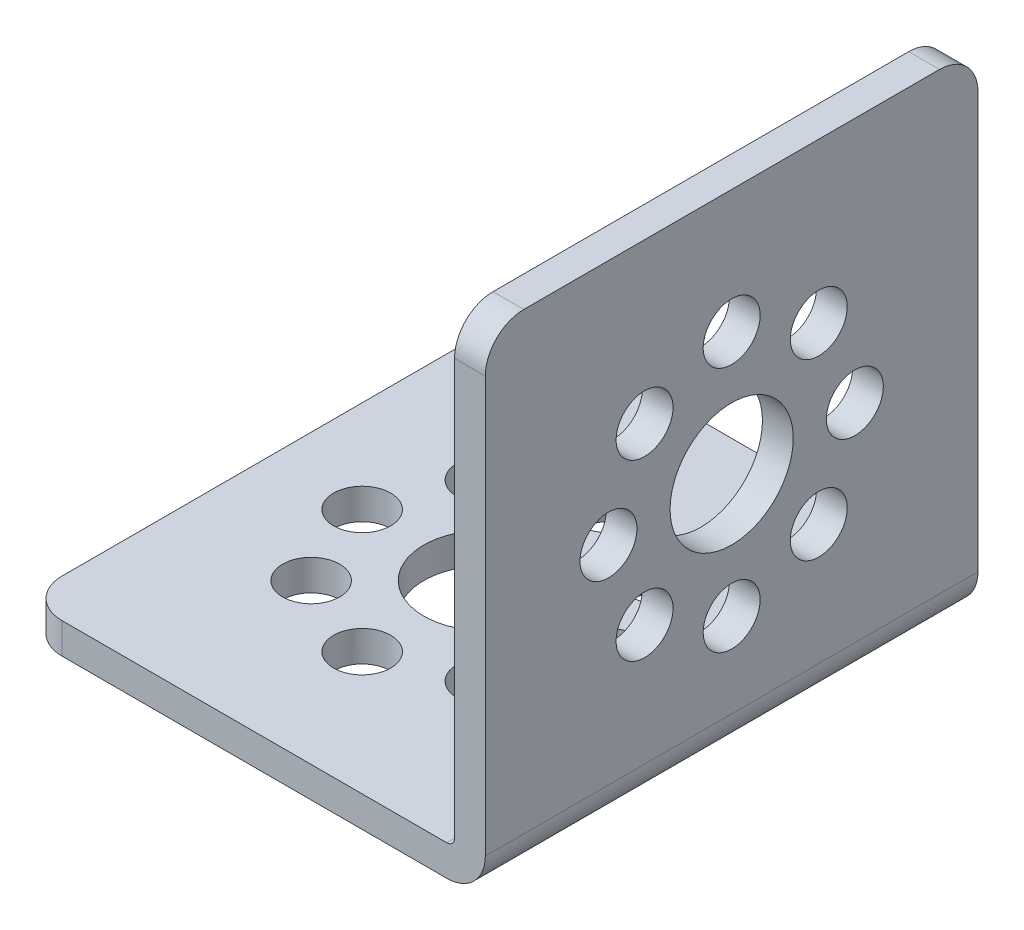
ISO-10303-21;
HEADER;
FILE_DESCRIPTION(('STEP AP214'),'2;1');
FILE_NAME('part.step','',(''),(''),'','','');
FILE_SCHEMA(('AUTOMOTIVE_DESIGN { 1 0 10303 214 1 1 1 1 }'));
ENDSEC;
DATA;
#1=APPLICATION_CONTEXT('core data for automotive mechanical design processes');
#2=APPLICATION_PROTOCOL_DEFINITION('international standard','automotive_design',2000,#1);
#3=PRODUCT_CONTEXT('',#1,'mechanical');
#4=PRODUCT('Part','Part','',(#3));
#5=PRODUCT_RELATED_PRODUCT_CATEGORY('part','',(#4));
#6=PRODUCT_DEFINITION_FORMATION('','',#4);
#7=PRODUCT_DEFINITION_CONTEXT('part definition',#1,'design');
#8=PRODUCT_DEFINITION('design','',#6,#7);
#9=PRODUCT_DEFINITION_SHAPE('','',#8);
#10=(LENGTH_UNIT() NAMED_UNIT(*) SI_UNIT(.MILLI.,.METRE.));
#11=(NAMED_UNIT(*) PLANE_ANGLE_UNIT() SI_UNIT($,.RADIAN.));
#12=(NAMED_UNIT(*) SI_UNIT($,.STERADIAN.) SOLID_ANGLE_UNIT());
#13=UNCERTAINTY_MEASURE_WITH_UNIT(LENGTH_MEASURE(1.E-05),#10,'distance_accuracy_value','');
#14=(GEOMETRIC_REPRESENTATION_CONTEXT(3) GLOBAL_UNCERTAINTY_ASSIGNED_CONTEXT((#13)) GLOBAL_UNIT_ASSIGNED_CONTEXT((#10,
#11,#12)) REPRESENTATION_CONTEXT('',''));
#15=CARTESIAN_POINT('',(0.,0.,0.));
#16=DIRECTION('',(0.,0.,1.));
#17=DIRECTION('',(1.,0.,0.));
#18=AXIS2_PLACEMENT_3D('',#15,#16,#17);
#19=CARTESIAN_POINT('',(-13.5,2.5,16.));
#20=DIRECTION('',(0.,0.,-1.));
#21=DIRECTION('',(-1.,0.,0.));
#22=AXIS2_PLACEMENT_3D('',#19,#20,#21);
#23=CYLINDRICAL_SURFACE('',#22,2.5);
#24=DIRECTION('',(0.,0.,-1.));
#25=VECTOR('',#24,1.);
#26=CARTESIAN_POINT('',(-13.5,0.,16.));
#27=LINE('',#26,#25);
#28=CARTESIAN_POINT('',(-13.5,0.,15.));
#29=VERTEX_POINT('',#28);
#30=CARTESIAN_POINT('',(-13.5,0.,-15.));
#31=VERTEX_POINT('',#30);
#32=EDGE_CURVE('E151',#29,#31,#27,.T.);
#33=ORIENTED_EDGE('',*,*,#32,.F.);
#34=CARTESIAN_POINT('',(-13.5,0.,15.));
#35=CARTESIAN_POINT('',(-13.5425945484461,6.10846210607041E-06,14.9432024778703));
#36=CARTESIAN_POINT('',(-13.5827342058114,0.0010869661887599,14.8846433654454));
#37=CARTESIAN_POINT('',(-13.6578674695257,0.00470530511481721,14.7643748349595));
#38=CARTESIAN_POINT('',(-13.6928625105844,0.007242379238851,14.7026663016879));
#39=CARTESIAN_POINT('',(-13.7880540707013,0.0158417425486205,14.5167561584178));
#40=CARTESIAN_POINT('',(-13.8407876548426,0.0229688547982109,14.3886414120868));
#41=CARTESIAN_POINT('',(-13.9017458329829,0.0324177360250915,14.1968835659889));
#42=CARTESIAN_POINT('',(-13.9186167532368,0.0352534756982862,14.1358516702943));
#43=CARTESIAN_POINT('',(-13.9476911594168,0.0403673146094255,14.012646175024));
#44=CARTESIAN_POINT('',(-13.9598950711363,0.0426454647120707,13.9504726801445));
#45=CARTESIAN_POINT('',(-13.9797896400511,0.046449021440134,13.8238124288917));
#46=CARTESIAN_POINT('',(-13.9873613632842,0.0479544435492506,13.7593064680308));
#47=CARTESIAN_POINT('',(-13.9974698951065,0.0499942113161725,13.6298687229311));
#48=CARTESIAN_POINT('',(-14.0000053292545,0.0505282918841908,13.5649368273009));
#49=CARTESIAN_POINT('',(-14.,0.0505102572168237,13.5));
#50=B_SPLINE_CURVE_WITH_KNOTS('',3,(#34,#35,#36,#37,#38,#39,#40,#41,#42,#43,#44,#45,#46,#47,#48,
#49),.UNSPECIFIED.,.F.,.F.,(4,2,2,2,2,2,2,4),(0.,0.2127955556866,0.425531654776994,
0.839442994762466,1.02946395975276,1.21946758409433,1.41416470985673,1.60891496263684),.UNSPECIFIED.);
#51=CARTESIAN_POINT('',(-14.,0.0505102572168239,13.5));
#52=VERTEX_POINT('',#51);
#53=EDGE_CURVE('E262',#29,#52,#50,.T.);
#54=ORIENTED_EDGE('',*,*,#53,.T.);
#55=DIRECTION('',(0.,0.,-1.));
#56=VECTOR('',#55,1.);
#57=CARTESIAN_POINT('',(-14.,0.0505102572168239,16.));
#58=LINE('',#57,#56);
#59=CARTESIAN_POINT('',(-14.,0.0505102572168239,-13.5));
#60=VERTEX_POINT('',#59);
#61=EDGE_CURVE('E309',#52,#60,#58,.T.);
#62=ORIENTED_EDGE('',*,*,#61,.T.);
#63=CARTESIAN_POINT('',(-14.,0.0505102572168239,-13.5));
#64=CARTESIAN_POINT('',(-14.0000079587461,0.0505361377770259,-13.5710053234085));
#65=CARTESIAN_POINT('',(-13.9969750687538,0.0498934246121133,-13.6420044608555));
#66=CARTESIAN_POINT('',(-13.9848905621802,0.0474603645145872,-13.7834539272455));
#67=CARTESIAN_POINT('',(-13.9758402623456,0.0456702686586032,-13.8539043728434));
#68=CARTESIAN_POINT('',(-13.9520995047711,0.0411913920545866,-13.9919165792114));
#69=CARTESIAN_POINT('',(-13.9375632907298,0.0385274276974296,-14.0595056293752));
#70=CARTESIAN_POINT('',(-13.9029654431423,0.0326277329746468,-14.1932040641045));
#71=CARTESIAN_POINT('',(-13.8829039884763,0.0293920211206174,-14.2593134964978));
#72=CARTESIAN_POINT('',(-13.81842766643,0.0200002303197489,-14.4438417368305));
#73=CARTESIAN_POINT('',(-13.7676226737195,0.0136501147106167,-14.5601161181464));
#74=CARTESIAN_POINT('',(-13.6779679939159,0.00615824080469354,-14.7290953910897));
#75=CARTESIAN_POINT('',(-13.6453560998811,0.00398634082564124,-14.785167832664));
#76=CARTESIAN_POINT('',(-13.5758470053485,0.000909137144144611,-14.8946538667326));
#77=CARTESIAN_POINT('',(-13.5389482383557,4.29803342420007E-06,-14.9480664770301));
#78=CARTESIAN_POINT('',(-13.5,0.,-15.));
#79=B_SPLINE_CURVE_WITH_KNOTS('',3,(#63,#64,#65,#66,#67,#68,#69,#70,#71,#72,#73,#74,#75,#76,#77,
#78),.UNSPECIFIED.,.F.,.F.,(4,2,2,2,2,2,2,4),(0.,0.212937993564529,0.425829406759689,
0.633134045049645,0.840431972620395,1.21985364255403,1.41438925082537,1.60899617057926),.UNSPECIFIED.);
#80=EDGE_CURVE('E256',#60,#31,#79,.T.);
#81=ORIENTED_EDGE('',*,*,#80,.T.);
#82=EDGE_LOOP('',(#33,#54,#62,#81));
#83=FACE_BOUND('',#82,.T.);
#84=ADVANCED_FACE('F35',(#83),#23,.T.);
#85=CARTESIAN_POINT('',(-13.5,0.,16.));
#86=DIRECTION('',(0.,1.,0.));
#87=DIRECTION('',(-1.,0.,0.));
#88=AXIS2_PLACEMENT_3D('',#85,#86,#87);
#89=PLANE('',#88);
#90=CARTESIAN_POINT('',(5.65685424949245,0.,-5.65685424949231));
#91=DIRECTION('',(0.,-1.,0.));
#92=DIRECTION('',(0.707106781186556,0.,-0.707106781186539));
#93=AXIS2_PLACEMENT_3D('',#90,#91,#92);
#94=CIRCLE('',#93,1.84999999999999);
#95=CARTESIAN_POINT('',(6.96500179468757,0.,-6.9650017946874));
#96=VERTEX_POINT('',#95);
#97=EDGE_CURVE('E249',#96,#96,#94,.T.);
#98=ORIENTED_EDGE('',*,*,#97,.F.);
#99=EDGE_LOOP('',(#98));
#100=FACE_BOUND('',#99,.T.);
#101=CARTESIAN_POINT('',(0.,0.,-8.));
#102=DIRECTION('',(0.,-1.,0.));
#103=DIRECTION('',(0.,0.,-1.));
#104=AXIS2_PLACEMENT_3D('',#101,#102,#103);
#105=CIRCLE('',#104,1.84999999999999);
#106=CARTESIAN_POINT('',(1.03173333320782E-13,0.,-9.84999999999999));
#107=VERTEX_POINT('',#106);
#108=EDGE_CURVE('E245',#107,#107,#105,.T.);
#109=ORIENTED_EDGE('',*,*,#108,.F.);
#110=EDGE_LOOP('',(#109));
#111=FACE_BOUND('',#110,.T.);
#112=CARTESIAN_POINT('',(-5.65685424949233,0.,-5.65685424949243));
#113=DIRECTION('',(0.,-1.,0.));
#114=DIRECTION('',(-0.707106781186541,0.,-0.707106781186554));
#115=AXIS2_PLACEMENT_3D('',#112,#113,#114);
#116=CIRCLE('',#115,1.84999999999999);
#117=CARTESIAN_POINT('',(-6.96500179468743,0.,-6.96500179468755));
#118=VERTEX_POINT('',#117);
#119=EDGE_CURVE('E241',#118,#118,#116,.T.);
#120=ORIENTED_EDGE('',*,*,#119,.F.);
#121=EDGE_LOOP('',(#120));
#122=FACE_BOUND('',#121,.T.);
#123=CARTESIAN_POINT('',(-8.,0.,0.));
#124=DIRECTION('',(0.,-1.,0.));
#125=DIRECTION('',(-1.,0.,0.));
#126=AXIS2_PLACEMENT_3D('',#123,#124,#125);
#127=CIRCLE('',#126,1.84999999999999);
#128=CARTESIAN_POINT('',(-9.84999999999999,0.,0.));
#129=VERTEX_POINT('',#128);
#130=EDGE_CURVE('E237',#129,#129,#127,.T.);
#131=ORIENTED_EDGE('',*,*,#130,.F.);
#132=EDGE_LOOP('',(#131));
#133=FACE_BOUND('',#132,.T.);
#134=CARTESIAN_POINT('',(-5.65685424949241,0.,5.65685424949235));
#135=DIRECTION('',(0.,-1.,0.));
#136=DIRECTION('',(-0.707106781186551,0.,0.707106781186544));
#137=AXIS2_PLACEMENT_3D('',#134,#135,#136);
#138=CIRCLE('',#137,1.84999999999999);
#139=CARTESIAN_POINT('',(-6.96500179468752,0.,6.96500179468745));
#140=VERTEX_POINT('',#139);
#141=EDGE_CURVE('E233',#140,#140,#138,.T.);
#142=ORIENTED_EDGE('',*,*,#141,.F.);
#143=EDGE_LOOP('',(#142));
#144=FACE_BOUND('',#143,.T.);
#145=CARTESIAN_POINT('',(0.,0.,8.));
#146=DIRECTION('',(0.,-1.,0.));
#147=DIRECTION('',(0.,0.,1.));
#148=AXIS2_PLACEMENT_3D('',#145,#146,#147);
#149=CIRCLE('',#148,1.84999999999999);
#150=CARTESIAN_POINT('',(0.,0.,9.84999999999999));
#151=VERTEX_POINT('',#150);
#152=EDGE_CURVE('E229',#151,#151,#149,.T.);
#153=ORIENTED_EDGE('',*,*,#152,.F.);
#154=EDGE_LOOP('',(#153));
#155=FACE_BOUND('',#154,.T.);
#156=CARTESIAN_POINT('',(5.65685424949237,0.,5.65685424949239));
#157=DIRECTION('',(0.,-1.,0.));
#158=DIRECTION('',(0.707106781186546,0.,0.707106781186549));
#159=AXIS2_PLACEMENT_3D('',#156,#157,#158);
#160=CIRCLE('',#159,1.84999999999999);
#161=CARTESIAN_POINT('',(6.96500179468748,0.,6.9650017946875));
#162=VERTEX_POINT('',#161);
#163=EDGE_CURVE('E225',#162,#162,#160,.T.);
#164=ORIENTED_EDGE('',*,*,#163,.F.);
#165=EDGE_LOOP('',(#164));
#166=FACE_BOUND('',#165,.T.);
#167=CARTESIAN_POINT('',(8.,0.,0.));
#168=DIRECTION('',(0.,-1.,0.));
#169=DIRECTION('',(1.,0.,0.));
#170=AXIS2_PLACEMENT_3D('',#167,#168,#169);
#171=CIRCLE('',#170,1.84999999999999);
#172=CARTESIAN_POINT('',(9.84999999999999,0.,0.));
#173=VERTEX_POINT('',#172);
#174=EDGE_CURVE('E221',#173,#173,#171,.T.);
#175=ORIENTED_EDGE('',*,*,#174,.F.);
#176=EDGE_LOOP('',(#175));
#177=FACE_BOUND('',#176,.T.);
#178=CARTESIAN_POINT('',(0.,0.,0.));
#179=DIRECTION('',(0.,-1.,0.));
#180=DIRECTION('',(1.,0.,0.));
#181=AXIS2_PLACEMENT_3D('',#178,#179,#180);
#182=CIRCLE('',#181,4.00000000000001);
#183=CARTESIAN_POINT('',(4.00000000000001,0.,0.));
#184=VERTEX_POINT('',#183);
#185=EDGE_CURVE('E216',#184,#184,#182,.T.);
#186=ORIENTED_EDGE('',*,*,#185,.F.);
#187=EDGE_LOOP('',(#186));
#188=FACE_BOUND('',#187,.T.);
#189=DIRECTION('',(1.,0.,0.));
#190=VECTOR('',#189,1.);
#191=CARTESIAN_POINT('',(-13.5,0.,16.));
#192=LINE('',#191,#190);
#193=CARTESIAN_POINT('',(-11.5,0.,16.));
#194=VERTEX_POINT('',#193);
#195=CARTESIAN_POINT('',(13.5,0.,16.));
#196=VERTEX_POINT('',#195);
#197=EDGE_CURVE('E132',#194,#196,#192,.T.);
#198=ORIENTED_EDGE('',*,*,#197,.F.);
#199=CARTESIAN_POINT('',(-11.5,0.,13.5));
#200=DIRECTION('',(0.,1.,0.));
#201=DIRECTION('',(-1.,0.,0.));
#202=AXIS2_PLACEMENT_3D('',#199,#200,#201);
#203=CIRCLE('',#202,2.5);
#204=EDGE_CURVE('E254',#194,#29,#203,.F.);
#205=ORIENTED_EDGE('',*,*,#204,.T.);
#206=ORIENTED_EDGE('',*,*,#32,.T.);
#207=CARTESIAN_POINT('',(-11.5,0.,-13.5));
#208=DIRECTION('',(0.,1.,0.));
#209=DIRECTION('',(-1.,0.,0.));
#210=AXIS2_PLACEMENT_3D('',#207,#208,#209);
#211=CIRCLE('',#210,2.5);
#212=CARTESIAN_POINT('',(-11.5,0.,-16.));
#213=VERTEX_POINT('',#212);
#214=EDGE_CURVE('E252',#31,#213,#211,.F.);
#215=ORIENTED_EDGE('',*,*,#214,.T.);
#216=DIRECTION('',(1.,0.,0.));
#217=VECTOR('',#216,1.);
#218=CARTESIAN_POINT('',(-13.5,0.,-16.));
#219=LINE('',#218,#217);
#220=CARTESIAN_POINT('',(13.5,0.,-16.));
#221=VERTEX_POINT('',#220);
#222=EDGE_CURVE('E148',#213,#221,#219,.T.);
#223=ORIENTED_EDGE('',*,*,#222,.T.);
#224=DIRECTION('',(0.,0.,-1.));
#225=VECTOR('',#224,1.);
#226=CARTESIAN_POINT('',(13.5,0.,16.));
#227=LINE('',#226,#225);
#228=EDGE_CURVE('E146',#196,#221,#227,.T.);
#229=ORIENTED_EDGE('',*,*,#228,.F.);
#230=EDGE_LOOP('',(#198,#205,#206,#215,#223,#229));
#231=FACE_BOUND('',#230,.T.);
#232=ADVANCED_FACE('F147',(#100,#111,#122,#133,#144,#155,#166,#177,#188,#231),#89,.F.);
#233=CARTESIAN_POINT('',(13.5,2.50000000000001,16.));
#234=DIRECTION('',(0.,0.,-1.));
#235=DIRECTION('',(-1.,0.,0.));
#236=AXIS2_PLACEMENT_3D('',#233,#234,#235);
#237=CYLINDRICAL_SURFACE('',#236,2.5);
#238=CARTESIAN_POINT('',(13.5,2.50000000000001,-16.));
#239=DIRECTION('',(0.,0.,1.));
#240=DIRECTION('',(-1.,0.,0.));
#241=AXIS2_PLACEMENT_3D('',#238,#239,#240);
#242=CIRCLE('',#241,2.5);
#243=CARTESIAN_POINT('',(16.,2.50000000000001,-16.));
#244=VERTEX_POINT('',#243);
#245=EDGE_CURVE('E170',#221,#244,#242,.T.);
#246=ORIENTED_EDGE('',*,*,#245,.T.);
#247=DIRECTION('',(0.,0.,-1.));
#248=VECTOR('',#247,1.);
#249=CARTESIAN_POINT('',(16.,2.50000000000001,16.));
#250=LINE('',#249,#248);
#251=CARTESIAN_POINT('',(16.,2.50000000000001,16.));
#252=VERTEX_POINT('',#251);
#253=EDGE_CURVE('E152',#252,#244,#250,.T.);
#254=ORIENTED_EDGE('',*,*,#253,.F.);
#255=CARTESIAN_POINT('',(13.5,2.50000000000001,16.));
#256=DIRECTION('',(0.,0.,1.));
#257=DIRECTION('',(-1.,0.,0.));
#258=AXIS2_PLACEMENT_3D('',#255,#256,#257);
#259=CIRCLE('',#258,2.5);
#260=EDGE_CURVE('E138',#196,#252,#259,.T.);
#261=ORIENTED_EDGE('',*,*,#260,.F.);
#262=ORIENTED_EDGE('',*,*,#228,.T.);
#263=EDGE_LOOP('',(#246,#254,#261,#262));
#264=FACE_BOUND('',#263,.T.);
#265=ADVANCED_FACE('F154',(#264),#237,.T.);
#266=CARTESIAN_POINT('',(16.,2.50000000000001,16.));
#267=DIRECTION('',(-1.,0.,0.));
#268=DIRECTION('',(0.,-1.,0.));
#269=AXIS2_PLACEMENT_3D('',#266,#267,#268);
#270=PLANE('',#269);
#271=CARTESIAN_POINT('',(16.,10.3431457505076,-5.65685424949231));
#272=DIRECTION('',(-1.,0.,0.));
#273=DIRECTION('',(0.,-0.707106781186556,-0.707106781186539));
#274=AXIS2_PLACEMENT_3D('',#271,#272,#273);
#275=CIRCLE('',#274,1.84999999999999);
#276=CARTESIAN_POINT('',(16.,9.03499820531244,-6.9650017946874));
#277=VERTEX_POINT('',#276);
#278=EDGE_CURVE('E310',#277,#277,#275,.T.);
#279=ORIENTED_EDGE('',*,*,#278,.T.);
#280=EDGE_LOOP('',(#279));
#281=FACE_BOUND('',#280,.T.);
#282=CARTESIAN_POINT('',(16.,15.9999999999999,-7.99999999999999));
#283=DIRECTION('',(-1.,0.,0.));
#284=DIRECTION('',(0.,0.,-1.));
#285=AXIS2_PLACEMENT_3D('',#282,#283,#284);
#286=CIRCLE('',#285,1.84999999999999);
#287=CARTESIAN_POINT('',(16.,15.9999999999999,-9.84999999999998));
#288=VERTEX_POINT('',#287);
#289=EDGE_CURVE('E318',#288,#288,#286,.T.);
#290=ORIENTED_EDGE('',*,*,#289,.T.);
#291=EDGE_LOOP('',(#290));
#292=FACE_BOUND('',#291,.T.);
#293=CARTESIAN_POINT('',(16.,21.6568542494923,-5.65685424949243));
#294=DIRECTION('',(-1.,0.,0.));
#295=DIRECTION('',(0.,0.707106781186541,-0.707106781186554));
#296=AXIS2_PLACEMENT_3D('',#293,#294,#295);
#297=CIRCLE('',#296,1.84999999999999);
#298=CARTESIAN_POINT('',(16.,22.9650017946874,-6.96500179468754));
#299=VERTEX_POINT('',#298);
#300=EDGE_CURVE('E324',#299,#299,#297,.T.);
#301=ORIENTED_EDGE('',*,*,#300,.T.);
#302=EDGE_LOOP('',(#301));
#303=FACE_BOUND('',#302,.T.);
#304=CARTESIAN_POINT('',(16.,24.,0.));
#305=DIRECTION('',(-1.,0.,0.));
#306=DIRECTION('',(0.,1.,0.));
#307=AXIS2_PLACEMENT_3D('',#304,#305,#306);
#308=CIRCLE('',#307,1.84999999999999);
#309=CARTESIAN_POINT('',(16.,25.85,0.));
#310=VERTEX_POINT('',#309);
#311=EDGE_CURVE('E330',#310,#310,#308,.T.);
#312=ORIENTED_EDGE('',*,*,#311,.T.);
#313=EDGE_LOOP('',(#312));
#314=FACE_BOUND('',#313,.T.);
#315=CARTESIAN_POINT('',(16.,21.6568542494924,5.65685424949233));
#316=DIRECTION('',(-1.,0.,0.));
#317=DIRECTION('',(0.,0.707106781186551,0.707106781186544));
#318=AXIS2_PLACEMENT_3D('',#315,#316,#317);
#319=CIRCLE('',#318,1.84999999999999);
#320=CARTESIAN_POINT('',(16.,22.9650017946875,6.96500179468743));
#321=VERTEX_POINT('',#320);
#322=EDGE_CURVE('E336',#321,#321,#319,.T.);
#323=ORIENTED_EDGE('',*,*,#322,.T.);
#324=EDGE_LOOP('',(#323));
#325=FACE_BOUND('',#324,.T.);
#326=CARTESIAN_POINT('',(16.,16.,7.99999999999998));
#327=DIRECTION('',(-1.,0.,0.));
#328=DIRECTION('',(0.,0.,1.));
#329=AXIS2_PLACEMENT_3D('',#326,#327,#328);
#330=CIRCLE('',#329,1.84999999999999);
#331=CARTESIAN_POINT('',(16.,16.,9.84999999999997));
#332=VERTEX_POINT('',#331);
#333=EDGE_CURVE('E342',#332,#332,#330,.T.);
#334=ORIENTED_EDGE('',*,*,#333,.T.);
#335=EDGE_LOOP('',(#334));
#336=FACE_BOUND('',#335,.T.);
#337=CARTESIAN_POINT('',(16.,10.3431457505076,5.65685424949237));
#338=DIRECTION('',(-1.,0.,0.));
#339=DIRECTION('',(0.,-0.707106781186546,0.707106781186549));
#340=AXIS2_PLACEMENT_3D('',#337,#338,#339);
#341=CIRCLE('',#340,1.84999999999999);
#342=CARTESIAN_POINT('',(16.,9.03499820531254,6.96500179468748));
#343=VERTEX_POINT('',#342);
#344=EDGE_CURVE('E348',#343,#343,#341,.T.);
#345=ORIENTED_EDGE('',*,*,#344,.T.);
#346=EDGE_LOOP('',(#345));
#347=FACE_BOUND('',#346,.T.);
#348=CARTESIAN_POINT('',(16.,8.00000000000002,0.));
#349=DIRECTION('',(-1.,0.,0.));
#350=DIRECTION('',(0.,-1.,0.));
#351=AXIS2_PLACEMENT_3D('',#348,#349,#350);
#352=CIRCLE('',#351,1.84999999999999);
#353=CARTESIAN_POINT('',(16.,6.15000000000003,0.));
#354=VERTEX_POINT('',#353);
#355=EDGE_CURVE('E220',#354,#354,#352,.T.);
#356=ORIENTED_EDGE('',*,*,#355,.T.);
#357=EDGE_LOOP('',(#356));
#358=FACE_BOUND('',#357,.T.);
#359=CARTESIAN_POINT('',(16.,16.,0.));
#360=DIRECTION('',(-1.,0.,0.));
#361=DIRECTION('',(0.,-1.,0.));
#362=AXIS2_PLACEMENT_3D('',#359,#360,#361);
#363=CIRCLE('',#362,4.00000000000001);
#364=CARTESIAN_POINT('',(16.,12.,0.));
#365=VERTEX_POINT('',#364);
#366=EDGE_CURVE('E375',#365,#365,#363,.T.);
#367=ORIENTED_EDGE('',*,*,#366,.T.);
#368=EDGE_LOOP('',(#367));
#369=FACE_BOUND('',#368,.T.);
#370=DIRECTION('',(0.,1.,0.));
#371=VECTOR('',#370,1.);
#372=CARTESIAN_POINT('',(16.,2.50000000000001,-16.));
#373=LINE('',#372,#371);
#374=CARTESIAN_POINT('',(16.,29.5,-16.));
#375=VERTEX_POINT('',#374);
#376=EDGE_CURVE('E173',#244,#375,#373,.T.);
#377=ORIENTED_EDGE('',*,*,#376,.T.);
#378=CARTESIAN_POINT('',(16.,29.5,-13.5));
#379=DIRECTION('',(-1.,0.,0.));
#380=DIRECTION('',(0.,-1.,0.));
#381=AXIS2_PLACEMENT_3D('',#378,#379,#380);
#382=CIRCLE('',#381,2.5);
#383=CARTESIAN_POINT('',(16.,32.,-13.5));
#384=VERTEX_POINT('',#383);
#385=EDGE_CURVE('E208',#375,#384,#382,.F.);
#386=ORIENTED_EDGE('',*,*,#385,.T.);
#387=DIRECTION('',(0.,0.,-1.));
#388=VECTOR('',#387,1.);
#389=CARTESIAN_POINT('',(16.,32.,16.));
#390=LINE('',#389,#388);
#391=CARTESIAN_POINT('',(16.,32.,13.5));
#392=VERTEX_POINT('',#391);
#393=EDGE_CURVE('E189',#392,#384,#390,.T.);
#394=ORIENTED_EDGE('',*,*,#393,.F.);
#395=CARTESIAN_POINT('',(16.,29.5,13.5));
#396=DIRECTION('',(-1.,0.,0.));
#397=DIRECTION('',(0.,-1.,0.));
#398=AXIS2_PLACEMENT_3D('',#395,#396,#397);
#399=CIRCLE('',#398,2.5);
#400=CARTESIAN_POINT('',(16.,29.5,16.));
#401=VERTEX_POINT('',#400);
#402=EDGE_CURVE('E206',#392,#401,#399,.F.);
#403=ORIENTED_EDGE('',*,*,#402,.T.);
#404=DIRECTION('',(0.,1.,0.));
#405=VECTOR('',#404,1.);
#406=CARTESIAN_POINT('',(16.,2.50000000000001,16.));
#407=LINE('',#406,#405);
#408=EDGE_CURVE('E157',#252,#401,#407,.T.);
#409=ORIENTED_EDGE('',*,*,#408,.F.);
#410=ORIENTED_EDGE('',*,*,#253,.T.);
#411=EDGE_LOOP('',(#377,#386,#394,#403,#409,#410));
#412=FACE_BOUND('',#411,.T.);
#413=ADVANCED_FACE('F390',(#281,#292,#303,#314,#325,#336,#347,#358,#369,#412),#270,.F.);
#414=CARTESIAN_POINT('',(16.,32.,16.));
#415=DIRECTION('',(0.,-1.,0.));
#416=DIRECTION('',(0.,0.,-1.));
#417=AXIS2_PLACEMENT_3D('',#414,#415,#416);
#418=PLANE('',#417);
#419=ORIENTED_EDGE('',*,*,#393,.T.);
#420=DIRECTION('',(-1.,0.,0.));
#421=VECTOR('',#420,1.);
#422=CARTESIAN_POINT('',(16.,32.,-13.5));
#423=LINE('',#422,#421);
#424=CARTESIAN_POINT('',(14.,32.,-13.5));
#425=VERTEX_POINT('',#424);
#426=EDGE_CURVE('E197',#384,#425,#423,.T.);
#427=ORIENTED_EDGE('',*,*,#426,.T.);
#428=DIRECTION('',(0.,0.,-1.));
#429=VECTOR('',#428,1.);
#430=CARTESIAN_POINT('',(14.,32.,16.));
#431=LINE('',#430,#429);
#432=CARTESIAN_POINT('',(14.,32.,13.5));
#433=VERTEX_POINT('',#432);
#434=EDGE_CURVE('E186',#433,#425,#431,.T.);
#435=ORIENTED_EDGE('',*,*,#434,.F.);
#436=DIRECTION('',(-1.,0.,0.));
#437=VECTOR('',#436,1.);
#438=CARTESIAN_POINT('',(16.,32.,13.5));
#439=LINE('',#438,#437);
#440=EDGE_CURVE('E195',#433,#392,#439,.F.);
#441=ORIENTED_EDGE('',*,*,#440,.T.);
#442=EDGE_LOOP('',(#419,#427,#435,#441));
#443=FACE_BOUND('',#442,.T.);
#444=ADVANCED_FACE('F436',(#443),#418,.F.);
#445=CARTESIAN_POINT('',(14.,32.,16.));
#446=DIRECTION('',(1.,0.,0.));
#447=DIRECTION('',(0.,1.,0.));
#448=AXIS2_PLACEMENT_3D('',#445,#446,#447);
#449=PLANE('',#448);
#450=CARTESIAN_POINT('',(14.,10.3431457505076,-5.65685424949231));
#451=DIRECTION('',(1.,0.,0.));
#452=DIRECTION('',(0.,1.,0.));
#453=AXIS2_PLACEMENT_3D('',#450,#451,#452);
#454=CIRCLE('',#453,1.84999999999999);
#455=CARTESIAN_POINT('',(14.,12.1931457505076,-5.65685424949231));
#456=VERTEX_POINT('',#455);
#457=EDGE_CURVE('E313',#456,#456,#454,.T.);
#458=ORIENTED_EDGE('',*,*,#457,.T.);
#459=EDGE_LOOP('',(#458));
#460=FACE_BOUND('',#459,.T.);
#461=CARTESIAN_POINT('',(14.,15.9999999999999,-7.99999999999999));
#462=DIRECTION('',(1.,0.,0.));
#463=DIRECTION('',(0.,1.,0.));
#464=AXIS2_PLACEMENT_3D('',#461,#462,#463);
#465=CIRCLE('',#464,1.84999999999999);
#466=CARTESIAN_POINT('',(14.,17.8499999999999,-7.99999999999999));
#467=VERTEX_POINT('',#466);
#468=EDGE_CURVE('E321',#467,#467,#465,.T.);
#469=ORIENTED_EDGE('',*,*,#468,.T.);
#470=EDGE_LOOP('',(#469));
#471=FACE_BOUND('',#470,.T.);
#472=CARTESIAN_POINT('',(14.,21.6568542494923,-5.65685424949243));
#473=DIRECTION('',(1.,0.,0.));
#474=DIRECTION('',(0.,1.,0.));
#475=AXIS2_PLACEMENT_3D('',#472,#473,#474);
#476=CIRCLE('',#475,1.84999999999999);
#477=CARTESIAN_POINT('',(14.,23.5068542494923,-5.65685424949243));
#478=VERTEX_POINT('',#477);
#479=EDGE_CURVE('E327',#478,#478,#476,.T.);
#480=ORIENTED_EDGE('',*,*,#479,.T.);
#481=EDGE_LOOP('',(#480));
#482=FACE_BOUND('',#481,.T.);
#483=CARTESIAN_POINT('',(14.,24.,0.));
#484=DIRECTION('',(1.,0.,0.));
#485=DIRECTION('',(0.,1.,0.));
#486=AXIS2_PLACEMENT_3D('',#483,#484,#485);
#487=CIRCLE('',#486,1.84999999999999);
#488=CARTESIAN_POINT('',(14.,25.85,0.));
#489=VERTEX_POINT('',#488);
#490=EDGE_CURVE('E333',#489,#489,#487,.T.);
#491=ORIENTED_EDGE('',*,*,#490,.T.);
#492=EDGE_LOOP('',(#491));
#493=FACE_BOUND('',#492,.T.);
#494=CARTESIAN_POINT('',(14.,21.6568542494924,5.65685424949233));
#495=DIRECTION('',(1.,0.,0.));
#496=DIRECTION('',(0.,1.,0.));
#497=AXIS2_PLACEMENT_3D('',#494,#495,#496);
#498=CIRCLE('',#497,1.84999999999999);
#499=CARTESIAN_POINT('',(14.,23.5068542494924,5.65685424949233));
#500=VERTEX_POINT('',#499);
#501=EDGE_CURVE('E339',#500,#500,#498,.T.);
#502=ORIENTED_EDGE('',*,*,#501,.T.);
#503=EDGE_LOOP('',(#502));
#504=FACE_BOUND('',#503,.T.);
#505=CARTESIAN_POINT('',(14.,16.,7.99999999999998));
#506=DIRECTION('',(1.,0.,0.));
#507=DIRECTION('',(0.,1.,0.));
#508=AXIS2_PLACEMENT_3D('',#505,#506,#507);
#509=CIRCLE('',#508,1.84999999999999);
#510=CARTESIAN_POINT('',(14.,17.85,7.99999999999998));
#511=VERTEX_POINT('',#510);
#512=EDGE_CURVE('E345',#511,#511,#509,.T.);
#513=ORIENTED_EDGE('',*,*,#512,.T.);
#514=EDGE_LOOP('',(#513));
#515=FACE_BOUND('',#514,.T.);
#516=CARTESIAN_POINT('',(14.,10.3431457505076,5.65685424949237));
#517=DIRECTION('',(1.,0.,0.));
#518=DIRECTION('',(0.,1.,0.));
#519=AXIS2_PLACEMENT_3D('',#516,#517,#518);
#520=CIRCLE('',#519,1.84999999999999);
#521=CARTESIAN_POINT('',(14.,12.1931457505076,5.65685424949237));
#522=VERTEX_POINT('',#521);
#523=EDGE_CURVE('E351',#522,#522,#520,.T.);
#524=ORIENTED_EDGE('',*,*,#523,.T.);
#525=EDGE_LOOP('',(#524));
#526=FACE_BOUND('',#525,.T.);
#527=CARTESIAN_POINT('',(14.,8.00000000000002,0.));
#528=DIRECTION('',(1.,0.,0.));
#529=DIRECTION('',(0.,1.,0.));
#530=AXIS2_PLACEMENT_3D('',#527,#528,#529);
#531=CIRCLE('',#530,1.84999999999999);
#532=CARTESIAN_POINT('',(14.,9.85000000000001,0.));
#533=VERTEX_POINT('',#532);
#534=EDGE_CURVE('E372',#533,#533,#531,.T.);
#535=ORIENTED_EDGE('',*,*,#534,.T.);
#536=EDGE_LOOP('',(#535));
#537=FACE_BOUND('',#536,.T.);
#538=CARTESIAN_POINT('',(14.,16.,0.));
#539=DIRECTION('',(1.,0.,0.));
#540=DIRECTION('',(0.,1.,0.));
#541=AXIS2_PLACEMENT_3D('',#538,#539,#540);
#542=CIRCLE('',#541,4.00000000000001);
#543=CARTESIAN_POINT('',(14.,20.,0.));
#544=VERTEX_POINT('',#543);
#545=EDGE_CURVE('E378',#544,#544,#542,.T.);
#546=ORIENTED_EDGE('',*,*,#545,.T.);
#547=EDGE_LOOP('',(#546));
#548=FACE_BOUND('',#547,.T.);
#549=ORIENTED_EDGE('',*,*,#434,.T.);
#550=CARTESIAN_POINT('',(14.,29.5,-13.5));
#551=DIRECTION('',(1.,0.,0.));
#552=DIRECTION('',(0.,1.,0.));
#553=AXIS2_PLACEMENT_3D('',#550,#551,#552);
#554=CIRCLE('',#553,2.5);
#555=CARTESIAN_POINT('',(14.,29.5,-16.));
#556=VERTEX_POINT('',#555);
#557=EDGE_CURVE('E202',#425,#556,#554,.F.);
#558=ORIENTED_EDGE('',*,*,#557,.T.);
#559=DIRECTION('',(0.,-1.,0.));
#560=VECTOR('',#559,1.);
#561=CARTESIAN_POINT('',(14.,32.,-16.));
#562=LINE('',#561,#560);
#563=CARTESIAN_POINT('',(14.,2.5,-16.));
#564=VERTEX_POINT('',#563);
#565=EDGE_CURVE('E176',#556,#564,#562,.T.);
#566=ORIENTED_EDGE('',*,*,#565,.T.);
#567=DIRECTION('',(0.,0.,-1.));
#568=VECTOR('',#567,1.);
#569=CARTESIAN_POINT('',(14.,2.5,16.));
#570=LINE('',#569,#568);
#571=CARTESIAN_POINT('',(14.,2.5,16.));
#572=VERTEX_POINT('',#571);
#573=EDGE_CURVE('E183',#572,#564,#570,.T.);
#574=ORIENTED_EDGE('',*,*,#573,.F.);
#575=DIRECTION('',(0.,-1.,0.));
#576=VECTOR('',#575,1.);
#577=CARTESIAN_POINT('',(14.,32.,16.));
#578=LINE('',#577,#576);
#579=CARTESIAN_POINT('',(14.,29.5,16.));
#580=VERTEX_POINT('',#579);
#581=EDGE_CURVE('E159',#580,#572,#578,.T.);
#582=ORIENTED_EDGE('',*,*,#581,.F.);
#583=CARTESIAN_POINT('',(14.,29.5,13.5));
#584=DIRECTION('',(1.,0.,0.));
#585=DIRECTION('',(0.,1.,0.));
#586=AXIS2_PLACEMENT_3D('',#583,#584,#585);
#587=CIRCLE('',#586,2.5);
#588=EDGE_CURVE('E200',#580,#433,#587,.F.);
#589=ORIENTED_EDGE('',*,*,#588,.T.);
#590=EDGE_LOOP('',(#549,#558,#566,#574,#582,#589));
#591=FACE_BOUND('',#590,.T.);
#592=ADVANCED_FACE('F433',(#460,#471,#482,#493,#504,#515,#526,#537,#548,#591),#449,.F.);
#593=CARTESIAN_POINT('',(13.5,2.5,16.));
#594=DIRECTION('',(0.,0.,-1.));
#595=DIRECTION('',(-1.,0.,0.));
#596=AXIS2_PLACEMENT_3D('',#593,#594,#595);
#597=CYLINDRICAL_SURFACE('',#596,0.5);
#598=CARTESIAN_POINT('',(13.5,2.5,-16.));
#599=DIRECTION('',(0.,0.,-1.));
#600=DIRECTION('',(-1.,0.,0.));
#601=AXIS2_PLACEMENT_3D('',#598,#599,#600);
#602=CIRCLE('',#601,0.5);
#603=CARTESIAN_POINT('',(13.5,2.,-16.));
#604=VERTEX_POINT('',#603);
#605=EDGE_CURVE('E178',#564,#604,#602,.T.);
#606=ORIENTED_EDGE('',*,*,#605,.T.);
#607=DIRECTION('',(0.,0.,-1.));
#608=VECTOR('',#607,1.);
#609=CARTESIAN_POINT('',(13.5,2.,16.));
#610=LINE('',#609,#608);
#611=CARTESIAN_POINT('',(13.5,2.,16.));
#612=VERTEX_POINT('',#611);
#613=EDGE_CURVE('E168',#612,#604,#610,.T.);
#614=ORIENTED_EDGE('',*,*,#613,.F.);
#615=CARTESIAN_POINT('',(13.5,2.5,16.));
#616=DIRECTION('',(0.,0.,-1.));
#617=DIRECTION('',(-1.,0.,0.));
#618=AXIS2_PLACEMENT_3D('',#615,#616,#617);
#619=CIRCLE('',#618,0.5);
#620=EDGE_CURVE('E164',#572,#612,#619,.T.);
#621=ORIENTED_EDGE('',*,*,#620,.F.);
#622=ORIENTED_EDGE('',*,*,#573,.T.);
#623=EDGE_LOOP('',(#606,#614,#621,#622));
#624=FACE_BOUND('',#623,.T.);
#625=ADVANCED_FACE('F418',(#624),#597,.F.);
#626=CARTESIAN_POINT('',(13.5,2.,16.));
#627=DIRECTION('',(0.,-1.,0.));
#628=DIRECTION('',(1.,0.,0.));
#629=AXIS2_PLACEMENT_3D('',#626,#627,#628);
#630=PLANE('',#629);
#631=CARTESIAN_POINT('',(5.65685424949245,2.,-5.65685424949231));
#632=DIRECTION('',(0.,-1.,0.));
#633=DIRECTION('',(1.,0.,0.));
#634=AXIS2_PLACEMENT_3D('',#631,#632,#633);
#635=CIRCLE('',#634,1.84999999999999);
#636=CARTESIAN_POINT('',(7.50685424949244,2.,-5.65685424949231));
#637=VERTEX_POINT('',#636);
#638=EDGE_CURVE('E246',#637,#637,#635,.T.);
#639=ORIENTED_EDGE('',*,*,#638,.T.);
#640=EDGE_LOOP('',(#639));
#641=FACE_BOUND('',#640,.T.);
#642=CARTESIAN_POINT('',(0.,2.,-8.));
#643=DIRECTION('',(0.,-1.,0.));
#644=DIRECTION('',(1.,0.,0.));
#645=AXIS2_PLACEMENT_3D('',#642,#643,#644);
#646=CIRCLE('',#645,1.84999999999999);
#647=CARTESIAN_POINT('',(1.85000000000007,2.,-8.));
#648=VERTEX_POINT('',#647);
#649=EDGE_CURVE('E242',#648,#648,#646,.T.);
#650=ORIENTED_EDGE('',*,*,#649,.T.);
#651=EDGE_LOOP('',(#650));
#652=FACE_BOUND('',#651,.T.);
#653=CARTESIAN_POINT('',(-5.65685424949233,2.,-5.65685424949243));
#654=DIRECTION('',(0.,-1.,0.));
#655=DIRECTION('',(1.,0.,0.));
#656=AXIS2_PLACEMENT_3D('',#653,#654,#655);
#657=CIRCLE('',#656,1.84999999999999);
#658=CARTESIAN_POINT('',(-3.80685424949234,2.,-5.65685424949243));
#659=VERTEX_POINT('',#658);
#660=EDGE_CURVE('E238',#659,#659,#657,.T.);
#661=ORIENTED_EDGE('',*,*,#660,.T.);
#662=EDGE_LOOP('',(#661));
#663=FACE_BOUND('',#662,.T.);
#664=CARTESIAN_POINT('',(-8.,2.,0.));
#665=DIRECTION('',(0.,-1.,0.));
#666=DIRECTION('',(1.,0.,0.));
#667=AXIS2_PLACEMENT_3D('',#664,#665,#666);
#668=CIRCLE('',#667,1.84999999999999);
#669=CARTESIAN_POINT('',(-6.15000000000001,2.,0.));
#670=VERTEX_POINT('',#669);
#671=EDGE_CURVE('E234',#670,#670,#668,.T.);
#672=ORIENTED_EDGE('',*,*,#671,.T.);
#673=EDGE_LOOP('',(#672));
#674=FACE_BOUND('',#673,.T.);
#675=CARTESIAN_POINT('',(-5.65685424949241,2.,5.65685424949235));
#676=DIRECTION('',(0.,-1.,0.));
#677=DIRECTION('',(1.,0.,0.));
#678=AXIS2_PLACEMENT_3D('',#675,#676,#677);
#679=CIRCLE('',#678,1.84999999999999);
#680=CARTESIAN_POINT('',(-3.80685424949242,2.,5.65685424949235));
#681=VERTEX_POINT('',#680);
#682=EDGE_CURVE('E230',#681,#681,#679,.T.);
#683=ORIENTED_EDGE('',*,*,#682,.T.);
#684=EDGE_LOOP('',(#683));
#685=FACE_BOUND('',#684,.T.);
#686=CARTESIAN_POINT('',(0.,2.,8.));
#687=DIRECTION('',(0.,-1.,0.));
#688=DIRECTION('',(1.,0.,0.));
#689=AXIS2_PLACEMENT_3D('',#686,#687,#688);
#690=CIRCLE('',#689,1.84999999999999);
#691=CARTESIAN_POINT('',(1.84999999999996,2.,8.));
#692=VERTEX_POINT('',#691);
#693=EDGE_CURVE('E226',#692,#692,#690,.T.);
#694=ORIENTED_EDGE('',*,*,#693,.T.);
#695=EDGE_LOOP('',(#694));
#696=FACE_BOUND('',#695,.T.);
#697=CARTESIAN_POINT('',(5.65685424949237,2.,5.65685424949239));
#698=DIRECTION('',(0.,-1.,0.));
#699=DIRECTION('',(1.,0.,0.));
#700=AXIS2_PLACEMENT_3D('',#697,#698,#699);
#701=CIRCLE('',#700,1.84999999999999);
#702=CARTESIAN_POINT('',(7.50685424949236,2.,5.65685424949239));
#703=VERTEX_POINT('',#702);
#704=EDGE_CURVE('E222',#703,#703,#701,.T.);
#705=ORIENTED_EDGE('',*,*,#704,.T.);
#706=EDGE_LOOP('',(#705));
#707=FACE_BOUND('',#706,.T.);
#708=CARTESIAN_POINT('',(8.,2.,0.));
#709=DIRECTION('',(0.,-1.,0.));
#710=DIRECTION('',(1.,0.,0.));
#711=AXIS2_PLACEMENT_3D('',#708,#709,#710);
#712=CIRCLE('',#711,1.84999999999999);
#713=CARTESIAN_POINT('',(9.84999999999999,2.,0.));
#714=VERTEX_POINT('',#713);
#715=EDGE_CURVE('E217',#714,#714,#712,.T.);
#716=ORIENTED_EDGE('',*,*,#715,.T.);
#717=EDGE_LOOP('',(#716));
#718=FACE_BOUND('',#717,.T.);
#719=CARTESIAN_POINT('',(0.,2.,0.));
#720=DIRECTION('',(0.,-1.,0.));
#721=DIRECTION('',(1.,0.,0.));
#722=AXIS2_PLACEMENT_3D('',#719,#720,#721);
#723=CIRCLE('',#722,4.00000000000001);
#724=CARTESIAN_POINT('',(4.00000000000001,2.,0.));
#725=VERTEX_POINT('',#724);
#726=EDGE_CURVE('E171',#725,#725,#723,.T.);
#727=ORIENTED_EDGE('',*,*,#726,.T.);
#728=EDGE_LOOP('',(#727));
#729=FACE_BOUND('',#728,.T.);
#730=DIRECTION('',(0.,0.,-1.));
#731=VECTOR('',#730,1.);
#732=CARTESIAN_POINT('',(-14.,2.,16.));
#733=LINE('',#732,#731);
#734=CARTESIAN_POINT('',(-14.,2.,13.5));
#735=VERTEX_POINT('',#734);
#736=CARTESIAN_POINT('',(-14.,2.,-13.5));
#737=VERTEX_POINT('',#736);
#738=EDGE_CURVE('E213',#735,#737,#733,.T.);
#739=ORIENTED_EDGE('',*,*,#738,.F.);
#740=CARTESIAN_POINT('',(-11.5,2.,13.5));
#741=DIRECTION('',(0.,-1.,0.));
#742=DIRECTION('',(1.,0.,0.));
#743=AXIS2_PLACEMENT_3D('',#740,#741,#742);
#744=CIRCLE('',#743,2.5);
#745=CARTESIAN_POINT('',(-11.5,2.,16.));
#746=VERTEX_POINT('',#745);
#747=EDGE_CURVE('E44',#735,#746,#744,.F.);
#748=ORIENTED_EDGE('',*,*,#747,.T.);
#749=DIRECTION('',(-1.,0.,0.));
#750=VECTOR('',#749,1.);
#751=CARTESIAN_POINT('',(13.5,2.,16.));
#752=LINE('',#751,#750);
#753=EDGE_CURVE('E166',#612,#746,#752,.T.);
#754=ORIENTED_EDGE('',*,*,#753,.F.);
#755=ORIENTED_EDGE('',*,*,#613,.T.);
#756=DIRECTION('',(-1.,0.,0.));
#757=VECTOR('',#756,1.);
#758=CARTESIAN_POINT('',(13.5,2.,-16.));
#759=LINE('',#758,#757);
#760=CARTESIAN_POINT('',(-11.5,2.,-16.));
#761=VERTEX_POINT('',#760);
#762=EDGE_CURVE('E143',#604,#761,#759,.T.);
#763=ORIENTED_EDGE('',*,*,#762,.T.);
#764=CARTESIAN_POINT('',(-11.5,2.,-13.5));
#765=DIRECTION('',(0.,-1.,0.));
#766=DIRECTION('',(1.,0.,0.));
#767=AXIS2_PLACEMENT_3D('',#764,#765,#766);
#768=CIRCLE('',#767,2.5);
#769=EDGE_CURVE('E56',#761,#737,#768,.F.);
#770=ORIENTED_EDGE('',*,*,#769,.T.);
#771=EDGE_LOOP('',(#739,#748,#754,#755,#763,#770));
#772=FACE_BOUND('',#771,.T.);
#773=ADVANCED_FACE('F415',(#641,#652,#663,#674,#685,#696,#707,#718,#729,#772),#630,.F.);
#774=CARTESIAN_POINT('',(-13.5,2.5,16.));
#775=DIRECTION('',(0.,0.,1.));
#776=DIRECTION('',(1.,0.,0.));
#777=AXIS2_PLACEMENT_3D('',#774,#775,#776);
#778=PLANE('',#777);
#779=ORIENTED_EDGE('',*,*,#753,.T.);
#780=DIRECTION('',(0.,-1.,0.));
#781=VECTOR('',#780,1.);
#782=CARTESIAN_POINT('',(-11.5,0.0505102572168248,16.));
#783=LINE('',#782,#781);
#784=EDGE_CURVE('E141',#746,#194,#783,.T.);
#785=ORIENTED_EDGE('',*,*,#784,.T.);
#786=ORIENTED_EDGE('',*,*,#197,.T.);
#787=ORIENTED_EDGE('',*,*,#260,.T.);
#788=ORIENTED_EDGE('',*,*,#408,.T.);
#789=DIRECTION('',(-1.,0.,0.));
#790=VECTOR('',#789,1.);
#791=CARTESIAN_POINT('',(14.,29.5,16.));
#792=LINE('',#791,#790);
#793=EDGE_CURVE('E210',#401,#580,#792,.T.);
#794=ORIENTED_EDGE('',*,*,#793,.T.);
#795=ORIENTED_EDGE('',*,*,#581,.T.);
#796=ORIENTED_EDGE('',*,*,#620,.T.);
#797=EDGE_LOOP('',(#779,#785,#786,#787,#788,#794,#795,#796));
#798=FACE_BOUND('',#797,.T.);
#799=ADVANCED_FACE('F135',(#798),#778,.T.);
#800=CARTESIAN_POINT('',(-13.5,2.5,-16.));
#801=DIRECTION('',(0.,0.,1.));
#802=DIRECTION('',(1.,0.,0.));
#803=AXIS2_PLACEMENT_3D('',#800,#801,#802);
#804=PLANE('',#803);
#805=ORIENTED_EDGE('',*,*,#222,.F.);
#806=DIRECTION('',(0.,-1.,0.));
#807=VECTOR('',#806,1.);
#808=CARTESIAN_POINT('',(-11.5,2.5,-16.));
#809=LINE('',#808,#807);
#810=EDGE_CURVE('E12',#213,#761,#809,.F.);
#811=ORIENTED_EDGE('',*,*,#810,.T.);
#812=ORIENTED_EDGE('',*,*,#762,.F.);
#813=ORIENTED_EDGE('',*,*,#605,.F.);
#814=ORIENTED_EDGE('',*,*,#565,.F.);
#815=DIRECTION('',(-1.,0.,0.));
#816=VECTOR('',#815,1.);
#817=CARTESIAN_POINT('',(-13.5,29.5,-16.));
#818=LINE('',#817,#816);
#819=EDGE_CURVE('E204',#556,#375,#818,.F.);
#820=ORIENTED_EDGE('',*,*,#819,.T.);
#821=ORIENTED_EDGE('',*,*,#376,.F.);
#822=ORIENTED_EDGE('',*,*,#245,.F.);
#823=EDGE_LOOP('',(#805,#811,#812,#813,#814,#820,#821,#822));
#824=FACE_BOUND('',#823,.T.);
#825=ADVANCED_FACE('F278',(#824),#804,.F.);
#826=CARTESIAN_POINT('',(16.,29.5,-13.5));
#827=DIRECTION('',(-1.,0.,0.));
#828=DIRECTION('',(0.,0.,1.));
#829=AXIS2_PLACEMENT_3D('',#826,#827,#828);
#830=CYLINDRICAL_SURFACE('',#829,2.5);
#831=ORIENTED_EDGE('',*,*,#385,.F.);
#832=ORIENTED_EDGE('',*,*,#819,.F.);
#833=ORIENTED_EDGE('',*,*,#557,.F.);
#834=ORIENTED_EDGE('',*,*,#426,.F.);
#835=EDGE_LOOP('',(#831,#832,#833,#834));
#836=FACE_BOUND('',#835,.T.);
#837=ADVANCED_FACE('F273',(#836),#830,.T.);
#838=CARTESIAN_POINT('',(-13.5,29.5,13.5));
#839=DIRECTION('',(1.,0.,0.));
#840=DIRECTION('',(0.,0.,-1.));
#841=AXIS2_PLACEMENT_3D('',#838,#839,#840);
#842=CYLINDRICAL_SURFACE('',#841,2.5);
#843=ORIENTED_EDGE('',*,*,#402,.F.);
#844=ORIENTED_EDGE('',*,*,#440,.F.);
#845=ORIENTED_EDGE('',*,*,#588,.F.);
#846=ORIENTED_EDGE('',*,*,#793,.F.);
#847=EDGE_LOOP('',(#843,#844,#845,#846));
#848=FACE_BOUND('',#847,.T.);
#849=ADVANCED_FACE('F277',(#848),#842,.T.);
#850=CARTESIAN_POINT('',(0.,32.,0.));
#851=DIRECTION('',(0.,-1.,0.));
#852=DIRECTION('',(1.,0.,0.));
#853=AXIS2_PLACEMENT_3D('',#850,#851,#852);
#854=CYLINDRICAL_SURFACE('',#853,4.00000000000001);
#855=ORIENTED_EDGE('',*,*,#185,.T.);
#856=EDGE_LOOP('',(#855));
#857=FACE_BOUND('',#856,.T.);
#858=ORIENTED_EDGE('',*,*,#726,.F.);
#859=EDGE_LOOP('',(#858));
#860=FACE_BOUND('',#859,.T.);
#861=ADVANCED_FACE('F281',(#857,#860),#854,.F.);
#862=CARTESIAN_POINT('',(16.,16.,0.));
#863=DIRECTION('',(-1.,0.,0.));
#864=DIRECTION('',(0.,-1.,0.));
#865=AXIS2_PLACEMENT_3D('',#862,#863,#864);
#866=CYLINDRICAL_SURFACE('',#865,4.00000000000001);
#867=ORIENTED_EDGE('',*,*,#366,.F.);
#868=EDGE_LOOP('',(#867));
#869=FACE_BOUND('',#868,.T.);
#870=ORIENTED_EDGE('',*,*,#545,.F.);
#871=EDGE_LOOP('',(#870));
#872=FACE_BOUND('',#871,.T.);
#873=ADVANCED_FACE('F477',(#869,#872),#866,.F.);
#874=CARTESIAN_POINT('',(16.,8.00000000000002,0.));
#875=DIRECTION('',(-1.,0.,0.));
#876=DIRECTION('',(0.,-1.,0.));
#877=AXIS2_PLACEMENT_3D('',#874,#875,#876);
#878=CYLINDRICAL_SURFACE('',#877,1.84999999999999);
#879=ORIENTED_EDGE('',*,*,#355,.F.);
#880=EDGE_LOOP('',(#879));
#881=FACE_BOUND('',#880,.T.);
#882=ORIENTED_EDGE('',*,*,#534,.F.);
#883=EDGE_LOOP('',(#882));
#884=FACE_BOUND('',#883,.T.);
#885=ADVANCED_FACE('F411',(#881,#884),#878,.F.);
#886=CARTESIAN_POINT('',(7.99999999999999,32.,0.));
#887=DIRECTION('',(0.,-1.,0.));
#888=DIRECTION('',(1.,0.,0.));
#889=AXIS2_PLACEMENT_3D('',#886,#887,#888);
#890=CYLINDRICAL_SURFACE('',#889,1.84999999999999);
#891=ORIENTED_EDGE('',*,*,#174,.T.);
#892=EDGE_LOOP('',(#891));
#893=FACE_BOUND('',#892,.T.);
#894=ORIENTED_EDGE('',*,*,#715,.F.);
#895=EDGE_LOOP('',(#894));
#896=FACE_BOUND('',#895,.T.);
#897=ADVANCED_FACE('F407',(#893,#896),#890,.F.);
#898=CARTESIAN_POINT('',(5.65685424949237,32.,5.65685424949239));
#899=DIRECTION('',(0.,-1.,0.));
#900=DIRECTION('',(1.,0.,0.));
#901=AXIS2_PLACEMENT_3D('',#898,#899,#900);
#902=CYLINDRICAL_SURFACE('',#901,1.84999999999999);
#903=ORIENTED_EDGE('',*,*,#163,.T.);
#904=EDGE_LOOP('',(#903));
#905=FACE_BOUND('',#904,.T.);
#906=ORIENTED_EDGE('',*,*,#704,.F.);
#907=EDGE_LOOP('',(#906));
#908=FACE_BOUND('',#907,.T.);
#909=ADVANCED_FACE('F410',(#905,#908),#902,.F.);
#910=CARTESIAN_POINT('',(0.,32.,8.));
#911=DIRECTION('',(0.,-1.,0.));
#912=DIRECTION('',(1.,0.,0.));
#913=AXIS2_PLACEMENT_3D('',#910,#911,#912);
#914=CYLINDRICAL_SURFACE('',#913,1.84999999999999);
#915=ORIENTED_EDGE('',*,*,#152,.T.);
#916=EDGE_LOOP('',(#915));
#917=FACE_BOUND('',#916,.T.);
#918=ORIENTED_EDGE('',*,*,#693,.F.);
#919=EDGE_LOOP('',(#918));
#920=FACE_BOUND('',#919,.T.);
#921=ADVANCED_FACE('F543',(#917,#920),#914,.F.);
#922=CARTESIAN_POINT('',(-5.65685424949242,32.,5.65685424949235));
#923=DIRECTION('',(0.,-1.,0.));
#924=DIRECTION('',(1.,0.,0.));
#925=AXIS2_PLACEMENT_3D('',#922,#923,#924);
#926=CYLINDRICAL_SURFACE('',#925,1.84999999999999);
#927=ORIENTED_EDGE('',*,*,#141,.T.);
#928=EDGE_LOOP('',(#927));
#929=FACE_BOUND('',#928,.T.);
#930=ORIENTED_EDGE('',*,*,#682,.F.);
#931=EDGE_LOOP('',(#930));
#932=FACE_BOUND('',#931,.T.);
#933=ADVANCED_FACE('F555',(#929,#932),#926,.F.);
#934=CARTESIAN_POINT('',(-8.00000000000001,32.,0.));
#935=DIRECTION('',(0.,-1.,0.));
#936=DIRECTION('',(1.,0.,0.));
#937=AXIS2_PLACEMENT_3D('',#934,#935,#936);
#938=CYLINDRICAL_SURFACE('',#937,1.84999999999999);
#939=ORIENTED_EDGE('',*,*,#130,.T.);
#940=EDGE_LOOP('',(#939));
#941=FACE_BOUND('',#940,.T.);
#942=ORIENTED_EDGE('',*,*,#671,.F.);
#943=EDGE_LOOP('',(#942));
#944=FACE_BOUND('',#943,.T.);
#945=ADVANCED_FACE('F566',(#941,#944),#938,.F.);
#946=CARTESIAN_POINT('',(-5.65685424949234,32.,-5.65685424949243));
#947=DIRECTION('',(0.,-1.,0.));
#948=DIRECTION('',(1.,0.,0.));
#949=AXIS2_PLACEMENT_3D('',#946,#947,#948);
#950=CYLINDRICAL_SURFACE('',#949,1.84999999999999);
#951=ORIENTED_EDGE('',*,*,#119,.T.);
#952=EDGE_LOOP('',(#951));
#953=FACE_BOUND('',#952,.T.);
#954=ORIENTED_EDGE('',*,*,#660,.F.);
#955=EDGE_LOOP('',(#954));
#956=FACE_BOUND('',#955,.T.);
#957=ADVANCED_FACE('F577',(#953,#956),#950,.F.);
#958=CARTESIAN_POINT('',(0.,32.,-8.));
#959=DIRECTION('',(0.,-1.,0.));
#960=DIRECTION('',(1.,0.,0.));
#961=AXIS2_PLACEMENT_3D('',#958,#959,#960);
#962=CYLINDRICAL_SURFACE('',#961,1.84999999999999);
#963=ORIENTED_EDGE('',*,*,#108,.T.);
#964=EDGE_LOOP('',(#963));
#965=FACE_BOUND('',#964,.T.);
#966=ORIENTED_EDGE('',*,*,#649,.F.);
#967=EDGE_LOOP('',(#966));
#968=FACE_BOUND('',#967,.T.);
#969=ADVANCED_FACE('F588',(#965,#968),#962,.F.);
#970=CARTESIAN_POINT('',(5.65685424949244,32.,-5.65685424949231));
#971=DIRECTION('',(0.,-1.,0.));
#972=DIRECTION('',(1.,0.,0.));
#973=AXIS2_PLACEMENT_3D('',#970,#971,#972);
#974=CYLINDRICAL_SURFACE('',#973,1.84999999999999);
#975=ORIENTED_EDGE('',*,*,#97,.T.);
#976=EDGE_LOOP('',(#975));
#977=FACE_BOUND('',#976,.T.);
#978=ORIENTED_EDGE('',*,*,#638,.F.);
#979=EDGE_LOOP('',(#978));
#980=FACE_BOUND('',#979,.T.);
#981=ADVANCED_FACE('F599',(#977,#980),#974,.F.);
#982=CARTESIAN_POINT('',(16.,10.3431457505076,5.65685424949237));
#983=DIRECTION('',(-1.,0.,0.));
#984=DIRECTION('',(0.,0.,1.));
#985=AXIS2_PLACEMENT_3D('',#982,#983,#984);
#986=CYLINDRICAL_SURFACE('',#985,1.84999999999999);
#987=ORIENTED_EDGE('',*,*,#344,.F.);
#988=EDGE_LOOP('',(#987));
#989=FACE_BOUND('',#988,.T.);
#990=ORIENTED_EDGE('',*,*,#523,.F.);
#991=EDGE_LOOP('',(#990));
#992=FACE_BOUND('',#991,.T.);
#993=ADVANCED_FACE('F609',(#989,#992),#986,.F.);
#994=CARTESIAN_POINT('',(16.,16.,7.99999999999998));
#995=DIRECTION('',(-1.,0.,0.));
#996=DIRECTION('',(0.,0.,1.));
#997=AXIS2_PLACEMENT_3D('',#994,#995,#996);
#998=CYLINDRICAL_SURFACE('',#997,1.84999999999999);
#999=ORIENTED_EDGE('',*,*,#333,.F.);
#1000=EDGE_LOOP('',(#999));
#1001=FACE_BOUND('',#1000,.T.);
#1002=ORIENTED_EDGE('',*,*,#512,.F.);
#1003=EDGE_LOOP('',(#1002));
#1004=FACE_BOUND('',#1003,.T.);
#1005=ADVANCED_FACE('F632',(#1001,#1004),#998,.F.);
#1006=CARTESIAN_POINT('',(16.,21.6568542494924,5.65685424949233));
#1007=DIRECTION('',(-1.,0.,0.));
#1008=DIRECTION('',(0.,-1.,0.));
#1009=AXIS2_PLACEMENT_3D('',#1006,#1007,#1008);
#1010=CYLINDRICAL_SURFACE('',#1009,1.84999999999999);
#1011=ORIENTED_EDGE('',*,*,#322,.F.);
#1012=EDGE_LOOP('',(#1011));
#1013=FACE_BOUND('',#1012,.T.);
#1014=ORIENTED_EDGE('',*,*,#501,.F.);
#1015=EDGE_LOOP('',(#1014));
#1016=FACE_BOUND('',#1015,.T.);
#1017=ADVANCED_FACE('F645',(#1013,#1016),#1010,.F.);
#1018=CARTESIAN_POINT('',(16.,24.,0.));
#1019=DIRECTION('',(-1.,0.,0.));
#1020=DIRECTION('',(0.,-1.,0.));
#1021=AXIS2_PLACEMENT_3D('',#1018,#1019,#1020);
#1022=CYLINDRICAL_SURFACE('',#1021,1.84999999999999);
#1023=ORIENTED_EDGE('',*,*,#311,.F.);
#1024=EDGE_LOOP('',(#1023));
#1025=FACE_BOUND('',#1024,.T.);
#1026=ORIENTED_EDGE('',*,*,#490,.F.);
#1027=EDGE_LOOP('',(#1026));
#1028=FACE_BOUND('',#1027,.T.);
#1029=ADVANCED_FACE('F657',(#1025,#1028),#1022,.F.);
#1030=CARTESIAN_POINT('',(16.,21.6568542494923,-5.65685424949243));
#1031=DIRECTION('',(-1.,0.,0.));
#1032=DIRECTION('',(0.,0.,1.));
#1033=AXIS2_PLACEMENT_3D('',#1030,#1031,#1032);
#1034=CYLINDRICAL_SURFACE('',#1033,1.84999999999999);
#1035=ORIENTED_EDGE('',*,*,#300,.F.);
#1036=EDGE_LOOP('',(#1035));
#1037=FACE_BOUND('',#1036,.T.);
#1038=ORIENTED_EDGE('',*,*,#479,.F.);
#1039=EDGE_LOOP('',(#1038));
#1040=FACE_BOUND('',#1039,.T.);
#1041=ADVANCED_FACE('F667',(#1037,#1040),#1034,.F.);
#1042=CARTESIAN_POINT('',(16.,15.9999999999999,-7.99999999999999));
#1043=DIRECTION('',(-1.,0.,0.));
#1044=DIRECTION('',(0.,0.,1.));
#1045=AXIS2_PLACEMENT_3D('',#1042,#1043,#1044);
#1046=CYLINDRICAL_SURFACE('',#1045,1.84999999999999);
#1047=ORIENTED_EDGE('',*,*,#289,.F.);
#1048=EDGE_LOOP('',(#1047));
#1049=FACE_BOUND('',#1048,.T.);
#1050=ORIENTED_EDGE('',*,*,#468,.F.);
#1051=EDGE_LOOP('',(#1050));
#1052=FACE_BOUND('',#1051,.T.);
#1053=ADVANCED_FACE('F677',(#1049,#1052),#1046,.F.);
#1054=CARTESIAN_POINT('',(16.,10.3431457505076,-5.65685424949231));
#1055=DIRECTION('',(-1.,0.,0.));
#1056=DIRECTION('',(0.,-1.,0.));
#1057=AXIS2_PLACEMENT_3D('',#1054,#1055,#1056);
#1058=CYLINDRICAL_SURFACE('',#1057,1.84999999999999);
#1059=ORIENTED_EDGE('',*,*,#278,.F.);
#1060=EDGE_LOOP('',(#1059));
#1061=FACE_BOUND('',#1060,.T.);
#1062=ORIENTED_EDGE('',*,*,#457,.F.);
#1063=EDGE_LOOP('',(#1062));
#1064=FACE_BOUND('',#1063,.T.);
#1065=ADVANCED_FACE('F293',(#1061,#1064),#1058,.F.);
#1066=CARTESIAN_POINT('',(-14.,0.,16.));
#1067=DIRECTION('',(1.,0.,0.));
#1068=DIRECTION('',(0.,1.,0.));
#1069=AXIS2_PLACEMENT_3D('',#1066,#1067,#1068);
#1070=PLANE('',#1069);
#1071=ORIENTED_EDGE('',*,*,#61,.F.);
#1072=DIRECTION('',(0.,-1.,0.));
#1073=VECTOR('',#1072,1.);
#1074=CARTESIAN_POINT('',(-14.,2.,13.5));
#1075=LINE('',#1074,#1073);
#1076=EDGE_CURVE('E299',#52,#735,#1075,.F.);
#1077=ORIENTED_EDGE('',*,*,#1076,.T.);
#1078=ORIENTED_EDGE('',*,*,#738,.T.);
#1079=DIRECTION('',(0.,-1.,0.));
#1080=VECTOR('',#1079,1.);
#1081=CARTESIAN_POINT('',(-14.,0.,-13.5));
#1082=LINE('',#1081,#1080);
#1083=EDGE_CURVE('E303',#737,#60,#1082,.T.);
#1084=ORIENTED_EDGE('',*,*,#1083,.T.);
#1085=EDGE_LOOP('',(#1071,#1077,#1078,#1084));
#1086=FACE_BOUND('',#1085,.T.);
#1087=ADVANCED_FACE('F286',(#1086),#1070,.F.);
#1088=CARTESIAN_POINT('',(-11.5,2.5,13.5));
#1089=DIRECTION('',(0.,1.,0.));
#1090=DIRECTION('',(-1.,0.,0.));
#1091=AXIS2_PLACEMENT_3D('',#1088,#1089,#1090);
#1092=CYLINDRICAL_SURFACE('',#1091,2.5);
#1093=ORIENTED_EDGE('',*,*,#747,.F.);
#1094=ORIENTED_EDGE('',*,*,#1076,.F.);
#1095=ORIENTED_EDGE('',*,*,#53,.F.);
#1096=ORIENTED_EDGE('',*,*,#204,.F.);
#1097=ORIENTED_EDGE('',*,*,#784,.F.);
#1098=EDGE_LOOP('',(#1093,#1094,#1095,#1096,#1097));
#1099=FACE_BOUND('',#1098,.T.);
#1100=ADVANCED_FACE('F283',(#1099),#1092,.T.);
#1101=CARTESIAN_POINT('',(-11.5,0.,-13.5));
#1102=DIRECTION('',(0.,-1.,0.));
#1103=DIRECTION('',(1.,0.,0.));
#1104=AXIS2_PLACEMENT_3D('',#1101,#1102,#1103);
#1105=CYLINDRICAL_SURFACE('',#1104,2.5);
#1106=ORIENTED_EDGE('',*,*,#769,.F.);
#1107=ORIENTED_EDGE('',*,*,#810,.F.);
#1108=ORIENTED_EDGE('',*,*,#214,.F.);
#1109=ORIENTED_EDGE('',*,*,#80,.F.);
#1110=ORIENTED_EDGE('',*,*,#1083,.F.);
#1111=EDGE_LOOP('',(#1106,#1107,#1108,#1109,#1110));
#1112=FACE_BOUND('',#1111,.T.);
#1113=ADVANCED_FACE('F37',(#1112),#1105,.T.);
#1114=CLOSED_SHELL('',(#84,#232,#265,#413,#444,#592,#625,#773,#799,#825,#837,#849,#861,#873,
#885,#897,#909,#921,#933,#945,#957,#969,#981,#993,#1005,#1017,#1029,#1041,#1053,#1065,#1087,
#1100,#1113));
#1115=MANIFOLD_SOLID_BREP('B2',#1114);
#1116=ADVANCED_BREP_SHAPE_REPRESENTATION('',(#18,#1115),#14);
#1117=SHAPE_DEFINITION_REPRESENTATION(#9,#1116);
ENDSEC;
END-ISO-10303-21;
